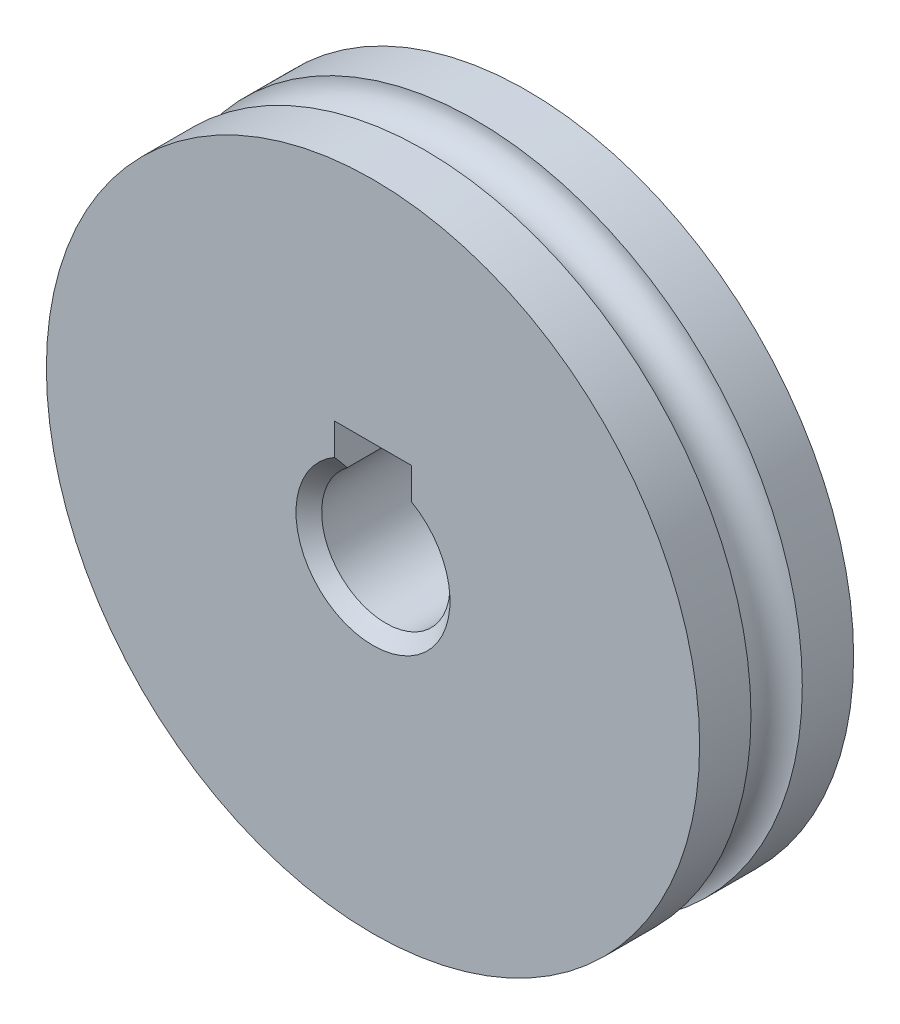
ISO-10303-21;
HEADER;
FILE_DESCRIPTION(('STEP AP214'),'2;1');
FILE_NAME('part.step','',(''),(''),'','','');
FILE_SCHEMA(('AUTOMOTIVE_DESIGN { 1 0 10303 214 1 1 1 1 }'));
ENDSEC;
DATA;
#1=APPLICATION_CONTEXT('core data for automotive mechanical design processes');
#2=APPLICATION_PROTOCOL_DEFINITION('international standard','automotive_design',2000,#1);
#3=PRODUCT_CONTEXT('',#1,'mechanical');
#4=PRODUCT('Part','Part','',(#3));
#5=PRODUCT_RELATED_PRODUCT_CATEGORY('part','',(#4));
#6=PRODUCT_DEFINITION_FORMATION('','',#4);
#7=PRODUCT_DEFINITION_CONTEXT('part definition',#1,'design');
#8=PRODUCT_DEFINITION('design','',#6,#7);
#9=PRODUCT_DEFINITION_SHAPE('','',#8);
#10=(LENGTH_UNIT() NAMED_UNIT(*) SI_UNIT(.MILLI.,.METRE.));
#11=(NAMED_UNIT(*) PLANE_ANGLE_UNIT() SI_UNIT($,.RADIAN.));
#12=(NAMED_UNIT(*) SI_UNIT($,.STERADIAN.) SOLID_ANGLE_UNIT());
#13=UNCERTAINTY_MEASURE_WITH_UNIT(LENGTH_MEASURE(1.E-05),#10,'distance_accuracy_value','');
#14=(GEOMETRIC_REPRESENTATION_CONTEXT(3) GLOBAL_UNCERTAINTY_ASSIGNED_CONTEXT((#13)) GLOBAL_UNIT_ASSIGNED_CONTEXT((#10,
#11,#12)) REPRESENTATION_CONTEXT('',''));
#15=CARTESIAN_POINT('',(0.,0.,0.));
#16=DIRECTION('',(0.,0.,1.));
#17=DIRECTION('',(1.,0.,0.));
#18=AXIS2_PLACEMENT_3D('',#15,#16,#17);
#19=CARTESIAN_POINT('',(0.,0.,12.));
#20=DIRECTION('',(0.,0.,-1.));
#21=DIRECTION('',(-1.,0.,0.));
#22=AXIS2_PLACEMENT_3D('',#19,#20,#21);
#23=CYLINDRICAL_SURFACE('',#22,25.45);
#24=CARTESIAN_POINT('',(0.,0.,8.));
#25=DIRECTION('',(0.,0.,-1.));
#26=DIRECTION('',(-1.,0.,0.));
#27=AXIS2_PLACEMENT_3D('',#24,#25,#26);
#28=CIRCLE('',#27,25.45);
#29=CARTESIAN_POINT('',(-25.45,0.,8.));
#30=VERTEX_POINT('',#29);
#31=EDGE_CURVE('E48',#30,#30,#28,.F.);
#32=ORIENTED_EDGE('',*,*,#31,.T.);
#33=EDGE_LOOP('',(#32));
#34=FACE_BOUND('',#33,.T.);
#35=CARTESIAN_POINT('',(0.,0.,12.));
#36=DIRECTION('',(0.,0.,1.));
#37=DIRECTION('',(1.,0.,0.));
#38=AXIS2_PLACEMENT_3D('',#35,#36,#37);
#39=CIRCLE('',#38,25.45);
#40=CARTESIAN_POINT('',(25.45,0.,12.));
#41=VERTEX_POINT('',#40);
#42=EDGE_CURVE('E177',#41,#41,#39,.T.);
#43=ORIENTED_EDGE('',*,*,#42,.F.);
#44=EDGE_LOOP('',(#43));
#45=FACE_BOUND('',#44,.T.);
#46=ADVANCED_FACE('F42',(#34,#45),#23,.T.);
#47=CARTESIAN_POINT('',(0.,0.,12.));
#48=DIRECTION('',(0.,0.,1.));
#49=DIRECTION('',(1.,0.,0.));
#50=AXIS2_PLACEMENT_3D('',#47,#48,#49);
#51=PLANE('',#50);
#52=DIRECTION('',(0.,1.,0.));
#53=VECTOR('',#52,1.);
#54=CARTESIAN_POINT('',(3.,0.,12.));
#55=LINE('',#54,#53);
#56=CARTESIAN_POINT('',(3.,5.19615242270663,12.));
#57=VERTEX_POINT('',#56);
#58=CARTESIAN_POINT('',(3.,7.65,12.));
#59=VERTEX_POINT('',#58);
#60=EDGE_CURVE('E174',#57,#59,#55,.T.);
#61=ORIENTED_EDGE('',*,*,#60,.F.);
#62=CARTESIAN_POINT('',(0.,0.,12.));
#63=DIRECTION('',(0.,0.,1.));
#64=DIRECTION('',(1.,0.,0.));
#65=AXIS2_PLACEMENT_3D('',#62,#63,#64);
#66=CIRCLE('',#65,6.);
#67=CARTESIAN_POINT('',(-3.,5.19615242270663,12.));
#68=VERTEX_POINT('',#67);
#69=EDGE_CURVE('E156',#57,#68,#66,.F.);
#70=ORIENTED_EDGE('',*,*,#69,.T.);
#71=DIRECTION('',(0.,-1.,0.));
#72=VECTOR('',#71,1.);
#73=CARTESIAN_POINT('',(-3.,0.,12.));
#74=LINE('',#73,#72);
#75=CARTESIAN_POINT('',(-3.,7.65,12.));
#76=VERTEX_POINT('',#75);
#77=EDGE_CURVE('E61',#76,#68,#74,.T.);
#78=ORIENTED_EDGE('',*,*,#77,.F.);
#79=DIRECTION('',(-1.,0.,0.));
#80=VECTOR('',#79,1.);
#81=CARTESIAN_POINT('',(0.,7.65,12.));
#82=LINE('',#81,#80);
#83=EDGE_CURVE('E106',#59,#76,#82,.T.);
#84=ORIENTED_EDGE('',*,*,#83,.F.);
#85=EDGE_LOOP('',(#61,#70,#78,#84));
#86=FACE_BOUND('',#85,.T.);
#87=ORIENTED_EDGE('',*,*,#42,.T.);
#88=EDGE_LOOP('',(#87));
#89=FACE_BOUND('',#88,.T.);
#90=ADVANCED_FACE('F191',(#86,#89),#51,.T.);
#91=CARTESIAN_POINT('',(0.,0.,0.));
#92=DIRECTION('',(0.,0.,1.));
#93=DIRECTION('',(1.,0.,0.));
#94=AXIS2_PLACEMENT_3D('',#91,#92,#93);
#95=PLANE('',#94);
#96=CARTESIAN_POINT('',(0.,0.,0.));
#97=DIRECTION('',(0.,0.,1.));
#98=DIRECTION('',(1.,0.,0.));
#99=AXIS2_PLACEMENT_3D('',#96,#97,#98);
#100=CIRCLE('',#99,6.00000000000001);
#101=CARTESIAN_POINT('',(-3.,5.19615242270665,0.));
#102=VERTEX_POINT('',#101);
#103=CARTESIAN_POINT('',(3.,5.19615242270665,0.));
#104=VERTEX_POINT('',#103);
#105=EDGE_CURVE('E171',#102,#104,#100,.T.);
#106=ORIENTED_EDGE('',*,*,#105,.T.);
#107=DIRECTION('',(0.,-1.,0.));
#108=VECTOR('',#107,1.);
#109=CARTESIAN_POINT('',(3.,0.,0.));
#110=LINE('',#109,#108);
#111=CARTESIAN_POINT('',(3.,7.65,0.));
#112=VERTEX_POINT('',#111);
#113=EDGE_CURVE('E117',#112,#104,#110,.T.);
#114=ORIENTED_EDGE('',*,*,#113,.F.);
#115=DIRECTION('',(1.,0.,0.));
#116=VECTOR('',#115,1.);
#117=CARTESIAN_POINT('',(0.,7.65,0.));
#118=LINE('',#117,#116);
#119=CARTESIAN_POINT('',(-3.,7.65,0.));
#120=VERTEX_POINT('',#119);
#121=EDGE_CURVE('E103',#120,#112,#118,.T.);
#122=ORIENTED_EDGE('',*,*,#121,.F.);
#123=DIRECTION('',(0.,1.,0.));
#124=VECTOR('',#123,1.);
#125=CARTESIAN_POINT('',(-3.,0.,0.));
#126=LINE('',#125,#124);
#127=EDGE_CURVE('E110',#102,#120,#126,.T.);
#128=ORIENTED_EDGE('',*,*,#127,.F.);
#129=EDGE_LOOP('',(#106,#114,#122,#128));
#130=FACE_BOUND('',#129,.T.);
#131=CARTESIAN_POINT('',(0.,0.,0.));
#132=DIRECTION('',(0.,0.,1.));
#133=DIRECTION('',(1.,0.,0.));
#134=AXIS2_PLACEMENT_3D('',#131,#132,#133);
#135=CIRCLE('',#134,25.45);
#136=CARTESIAN_POINT('',(25.45,0.,0.));
#137=VERTEX_POINT('',#136);
#138=EDGE_CURVE('E182',#137,#137,#135,.T.);
#139=ORIENTED_EDGE('',*,*,#138,.F.);
#140=EDGE_LOOP('',(#139));
#141=FACE_BOUND('',#140,.T.);
#142=ADVANCED_FACE('F119',(#130,#141),#95,.F.);
#143=CARTESIAN_POINT('',(0.,0.,4.));
#144=DIRECTION('',(0.,0.,1.));
#145=DIRECTION('',(1.,0.,0.));
#146=AXIS2_PLACEMENT_3D('',#143,#144,#145);
#147=CIRCLE('',#146,25.45);
#148=CARTESIAN_POINT('',(25.45,0.,4.));
#149=VERTEX_POINT('',#148);
#150=EDGE_CURVE('E162',#149,#149,#147,.F.);
#151=ORIENTED_EDGE('',*,*,#150,.T.);
#152=EDGE_LOOP('',(#151));
#153=FACE_BOUND('',#152,.T.);
#154=ORIENTED_EDGE('',*,*,#138,.T.);
#155=EDGE_LOOP('',(#154));
#156=FACE_BOUND('',#155,.T.);
#157=ADVANCED_FACE('F205',(#153,#156),#23,.T.);
#158=CARTESIAN_POINT('',(0.,0.,12.));
#159=DIRECTION('',(0.,0.,-1.));
#160=DIRECTION('',(-1.,0.,0.));
#161=AXIS2_PLACEMENT_3D('',#158,#159,#160);
#162=CYLINDRICAL_SURFACE('',#161,5.);
#163=DIRECTION('',(0.,0.,-1.));
#164=VECTOR('',#163,1.);
#165=CARTESIAN_POINT('',(3.,4.,12.));
#166=LINE('',#165,#164);
#167=CARTESIAN_POINT('',(3.,4.,1.00000000000001));
#168=VERTEX_POINT('',#167);
#169=CARTESIAN_POINT('',(3.,4.,11.));
#170=VERTEX_POINT('',#169);
#171=EDGE_CURVE('E134',#168,#170,#166,.F.);
#172=ORIENTED_EDGE('',*,*,#171,.F.);
#173=CARTESIAN_POINT('',(0.,0.,1.00000000000001));
#174=DIRECTION('',(0.,0.,1.));
#175=DIRECTION('',(1.,0.,0.));
#176=AXIS2_PLACEMENT_3D('',#173,#174,#175);
#177=CIRCLE('',#176,5.);
#178=CARTESIAN_POINT('',(-3.,4.,1.00000000000001));
#179=VERTEX_POINT('',#178);
#180=EDGE_CURVE('E173',#168,#179,#177,.F.);
#181=ORIENTED_EDGE('',*,*,#180,.T.);
#182=DIRECTION('',(0.,0.,-1.));
#183=VECTOR('',#182,1.);
#184=CARTESIAN_POINT('',(-3.,4.,12.));
#185=LINE('',#184,#183);
#186=CARTESIAN_POINT('',(-3.,4.,11.));
#187=VERTEX_POINT('',#186);
#188=EDGE_CURVE('E124',#187,#179,#185,.T.);
#189=ORIENTED_EDGE('',*,*,#188,.F.);
#190=CARTESIAN_POINT('',(0.,0.,11.));
#191=DIRECTION('',(0.,0.,1.));
#192=DIRECTION('',(1.,0.,0.));
#193=AXIS2_PLACEMENT_3D('',#190,#191,#192);
#194=CIRCLE('',#193,5.);
#195=EDGE_CURVE('E176',#187,#170,#194,.T.);
#196=ORIENTED_EDGE('',*,*,#195,.T.);
#197=EDGE_LOOP('',(#172,#181,#189,#196));
#198=FACE_BOUND('',#197,.T.);
#199=ADVANCED_FACE('F196',(#198),#162,.F.);
#200=CARTESIAN_POINT('',(0.,0.,0.));
#201=DIRECTION('',(0.,0.,-1.));
#202=DIRECTION('',(-1.,0.,0.));
#203=AXIS2_PLACEMENT_3D('',#200,#201,#202);
#204=CONICAL_SURFACE('',#203,6.00000000000001,0.785398163397447);
#205=CARTESIAN_POINT('',(3.,5.1969606973692,-0.0007));
#206=CARTESIAN_POINT('',(3.,5.10472855728946,0.0791743967310408));
#207=CARTESIAN_POINT('',(3.,5.01223735922472,0.158750325889475));
#208=CARTESIAN_POINT('',(3.,4.82665017824288,0.317200560471634));
#209=CARTESIAN_POINT('',(3.,4.73355417291088,0.3960748396317));
#210=CARTESIAN_POINT('',(3.,4.45305755189079,0.631631858152734));
#211=CARTESIAN_POINT('',(3.,4.264627386786,0.787093011964924));
#212=CARTESIAN_POINT('',(3.,3.87725980082647,1.09904002196056));
#213=CARTESIAN_POINT('',(3.,3.67818841873575,1.25536097624108));
#214=CARTESIAN_POINT('',(3.,3.3755560048686,1.48446230990329));
#215=CARTESIAN_POINT('',(3.,3.27402428222474,1.55992104438699));
#216=CARTESIAN_POINT('',(3.,3.06935093465372,1.70861807310558));
#217=CARTESIAN_POINT('',(3.,2.96620938959977,1.78185647697759));
#218=CARTESIAN_POINT('',(3.,2.74039239279639,1.93773663880136));
#219=CARTESIAN_POINT('',(3.,2.61736531153247,2.01987202257193));
#220=CARTESIAN_POINT('',(3.,2.36809320190826,2.1791795360388));
#221=CARTESIAN_POINT('',(3.,2.24184780361623,2.25635109153967));
#222=CARTESIAN_POINT('',(3.,1.98733264518479,2.40294286979608));
#223=CARTESIAN_POINT('',(3.,1.85911877135513,2.47245925182793));
#224=CARTESIAN_POINT('',(3.,1.59823390440243,2.60270952327153));
#225=CARTESIAN_POINT('',(3.,1.46556331585218,2.66344420722977));
#226=CARTESIAN_POINT('',(3.,1.22584450071836,2.76062307217585));
#227=CARTESIAN_POINT('',(3.,1.11977163076139,2.79945576339648));
#228=CARTESIAN_POINT('',(3.,0.904816144497557,2.86817062270726));
#229=CARTESIAN_POINT('',(3.,0.795936671364314,2.89806236807184));
#230=CARTESIAN_POINT('',(3.,0.629679946707935,2.93512008727962));
#231=CARTESIAN_POINT('',(3.,0.573171507830584,2.94624908320643));
#232=CARTESIAN_POINT('',(3.,0.459643907305309,2.9655075181252));
#233=CARTESIAN_POINT('',(3.,0.402624786401149,2.9736371942665));
#234=CARTESIAN_POINT('',(3.,0.287995465048128,2.98674722905691));
#235=CARTESIAN_POINT('',(3.,0.230383819288343,2.9917150167704));
#236=CARTESIAN_POINT('',(3.,0.114949768787396,2.99835526062211));
#237=CARTESIAN_POINT('',(3.,0.0571272922453328,3.00002646319238));
#238=CARTESIAN_POINT('',(3.,-0.000699999999999984,2.99999991833335));
#239=B_SPLINE_CURVE_WITH_KNOTS('',3,(#205,#206,#207,#208,#209,#210,#211,#212,#213,#214,#215,
#216,#217,#218,#219,#220,#221,#222,#223,#224,#225,#226,#227,#228,#229,#230,#231,#232,#233,#234,
#235,#236,#237,#238),.UNSPECIFIED.,.F.,.F.,(4,2,2,2,2,2,2,2,2,2,2,2,2,2,2,2,4),(0.,
0.366032714595263,0.732079073096792,1.46488368054643,2.22409183833252,2.6035739757146,
2.98303734412799,3.42672332377148,3.87046053524228,4.30776434015212,4.7450285540959,
5.08360199334359,5.42181145323432,5.59452564828179,5.76722618428539,5.94060911786272,
6.11405796978053),.UNSPECIFIED.);
#240=EDGE_CURVE('E69',#104,#168,#239,.T.);
#241=ORIENTED_EDGE('',*,*,#240,.F.);
#242=ORIENTED_EDGE('',*,*,#105,.F.);
#243=CARTESIAN_POINT('',(-3.,-0.0007,2.99999991833335));
#244=CARTESIAN_POINT('',(-3.,0.0454601457457147,3.00001440854145));
#245=CARTESIAN_POINT('',(-3.,0.0916137280076858,2.99895553984156));
#246=CARTESIAN_POINT('',(-3.,0.183816652352496,2.99472596268915));
#247=CARTESIAN_POINT('',(-3.,0.229866010330678,2.9915556015861));
#248=CARTESIAN_POINT('',(-3.,0.367537246473966,2.97894797467041));
#249=CARTESIAN_POINT('',(-3.,0.458890569986337,2.96641389742184));
#250=CARTESIAN_POINT('',(-3.,0.638499928581178,2.93405630969612));
#251=CARTESIAN_POINT('',(-3.,0.726781940843717,2.9143734159568));
#252=CARTESIAN_POINT('',(-3.,0.901679924472278,2.86856232202215));
#253=CARTESIAN_POINT('',(-3.,0.9882950711066,2.84243101539518));
#254=CARTESIAN_POINT('',(-3.,1.26135148662365,2.75040973203725));
#255=CARTESIAN_POINT('',(-3.,1.44429535337197,2.67413451006544));
#256=CARTESIAN_POINT('',(-3.,1.80185585108093,2.5040257618116));
#257=CARTESIAN_POINT('',(-3.,1.97645612608357,2.41015939176205));
#258=CARTESIAN_POINT('',(-3.,2.32244052483915,2.20874950510435));
#259=CARTESIAN_POINT('',(-3.,2.49367904246243,2.10095918034838));
#260=CARTESIAN_POINT('',(-3.,2.83055905078204,1.87735077307887));
#261=CARTESIAN_POINT('',(-3.,2.99620484837314,1.7615390876284));
#262=CARTESIAN_POINT('',(-3.,3.33989239604002,1.51229335425628));
#263=CARTESIAN_POINT('',(-3.,3.51749716241066,1.37826062968936));
#264=CARTESIAN_POINT('',(-3.,3.86903564909665,1.10539201685767));
#265=CARTESIAN_POINT('',(-3.,4.04296826943176,0.966554721365094));
#266=CARTESIAN_POINT('',(-3.,4.38135438943839,0.690853911137411));
#267=CARTESIAN_POINT('',(-3.,4.54591465920178,0.554121006950186));
#268=CARTESIAN_POINT('',(-3.,4.79118020796446,0.347258083091752));
#269=CARTESIAN_POINT('',(-3.,4.87264953373614,0.278030164089072));
#270=CARTESIAN_POINT('',(-3.,5.0351326568913,0.13904499213581));
#271=CARTESIAN_POINT('',(-3.,5.1161464635414,0.0692877500215555));
#272=CARTESIAN_POINT('',(-3.,5.1969606973692,-0.000700000000000611));
#273=B_SPLINE_CURVE_WITH_KNOTS('',3,(#243,#244,#245,#246,#247,#248,#249,#250,#251,#252,#253,
#254,#255,#256,#257,#258,#259,#260,#261,#262,#263,#264,#265,#266,#267,#268,#269,#270,#271,#272),
.UNSPECIFIED.,.F.,.F.,(4,2,2,2,2,2,2,2,2,2,2,2,2,2,4),(0.,0.138455031958443,0.276887293099806,
0.553129327254988,0.824208437821406,1.09541839271949,1.68843391610198,2.28256787075302,
2.88923870017065,3.49543115784571,4.16282666161247,4.83041932377153,5.47224776003407,
5.79297614342456,6.11369797846812),.UNSPECIFIED.);
#274=EDGE_CURVE('E113',#179,#102,#273,.T.);
#275=ORIENTED_EDGE('',*,*,#274,.F.);
#276=ORIENTED_EDGE('',*,*,#180,.F.);
#277=EDGE_LOOP('',(#241,#242,#275,#276));
#278=FACE_BOUND('',#277,.T.);
#279=ADVANCED_FACE('F137',(#278),#204,.F.);
#280=CARTESIAN_POINT('',(0.,0.,11.));
#281=DIRECTION('',(0.,0.,1.));
#282=DIRECTION('',(1.,0.,0.));
#283=AXIS2_PLACEMENT_3D('',#280,#281,#282);
#284=CONICAL_SURFACE('',#283,5.,0.785398163397447);
#285=CARTESIAN_POINT('',(3.,-0.0007,9.00000008166666));
#286=CARTESIAN_POINT('',(3.,0.0454601457457146,8.99998559145857));
#287=CARTESIAN_POINT('',(3.,0.0916137280076858,9.00104446015846));
#288=CARTESIAN_POINT('',(3.,0.183816652352496,9.00527403731087));
#289=CARTESIAN_POINT('',(3.,0.229866010330678,9.00844439841391));
#290=CARTESIAN_POINT('',(3.,0.367537246473966,9.0210520253296));
#291=CARTESIAN_POINT('',(3.,0.458890569986337,9.03358610257817));
#292=CARTESIAN_POINT('',(3.,0.638499928581178,9.0659436903039));
#293=CARTESIAN_POINT('',(3.,0.726781940843718,9.08562658404321));
#294=CARTESIAN_POINT('',(3.,0.901679924472279,9.13143767797786));
#295=CARTESIAN_POINT('',(3.,0.9882950711066,9.15756898460483));
#296=CARTESIAN_POINT('',(3.,1.26135148662365,9.24959026796277));
#297=CARTESIAN_POINT('',(3.,1.44429535337197,9.32586548993457));
#298=CARTESIAN_POINT('',(3.,1.80185585108092,9.49597423818841));
#299=CARTESIAN_POINT('',(3.,1.97645612608357,9.58984060823796));
#300=CARTESIAN_POINT('',(3.,2.32244052483915,9.79125049489566));
#301=CARTESIAN_POINT('',(3.,2.49367904246243,9.89904081965163));
#302=CARTESIAN_POINT('',(3.,2.83055905078204,10.1226492269211));
#303=CARTESIAN_POINT('',(3.,2.99620484837314,10.2384609123716));
#304=CARTESIAN_POINT('',(3.,3.33989239604001,10.4877066457437));
#305=CARTESIAN_POINT('',(3.,3.51749716241066,10.6217393703106));
#306=CARTESIAN_POINT('',(3.,3.86903564909664,10.8946079831423));
#307=CARTESIAN_POINT('',(3.,4.04296826943175,11.0334452786349));
#308=CARTESIAN_POINT('',(3.,4.38135438943838,11.3091460888626));
#309=CARTESIAN_POINT('',(3.,4.54591465920177,11.4458789930498));
#310=CARTESIAN_POINT('',(3.,4.79118020796444,11.6527419169082));
#311=CARTESIAN_POINT('',(3.,4.87264953373612,11.7219698359109));
#312=CARTESIAN_POINT('',(3.,5.03513265689129,11.8609550078642));
#313=CARTESIAN_POINT('',(3.,5.11614646354139,11.9307122499784));
#314=CARTESIAN_POINT('',(3.,5.19696069736918,12.0007));
#315=B_SPLINE_CURVE_WITH_KNOTS('',3,(#285,#286,#287,#288,#289,#290,#291,#292,#293,#294,#295,
#296,#297,#298,#299,#300,#301,#302,#303,#304,#305,#306,#307,#308,#309,#310,#311,#312,#313,#314),
.UNSPECIFIED.,.F.,.F.,(4,2,2,2,2,2,2,2,2,2,2,2,2,2,4),(0.,0.138455031958444,0.276887293099806,
0.553129327254988,0.824208437821406,1.09541839271949,1.68843391610197,2.28256787075302,
2.88923870017065,3.4954311578457,4.16282666161246,4.83041932377152,5.47224776003406,
5.79297614342454,6.1136979784681),.UNSPECIFIED.);
#316=EDGE_CURVE('E11',#170,#57,#315,.T.);
#317=ORIENTED_EDGE('',*,*,#316,.F.);
#318=ORIENTED_EDGE('',*,*,#195,.F.);
#319=CARTESIAN_POINT('',(-3.,5.19696069736918,12.0007));
#320=CARTESIAN_POINT('',(-3.,5.10472855728945,11.920825603269));
#321=CARTESIAN_POINT('',(-3.,5.01223735922471,11.8412496741105));
#322=CARTESIAN_POINT('',(-3.,4.82665017824287,11.6827994395284));
#323=CARTESIAN_POINT('',(-3.,4.73355417291086,11.6039251603683));
#324=CARTESIAN_POINT('',(-3.,4.45305755189077,11.3683681418473));
#325=CARTESIAN_POINT('',(-3.,4.26462738678599,11.2129069880351));
#326=CARTESIAN_POINT('',(-3.,3.87725980082646,10.9009599780394));
#327=CARTESIAN_POINT('',(-3.,3.67818841873574,10.7446390237589));
#328=CARTESIAN_POINT('',(-3.,3.37555600486859,10.5155376900967));
#329=CARTESIAN_POINT('',(-3.,3.27402428222473,10.440078955613));
#330=CARTESIAN_POINT('',(-3.,3.06935093465371,10.2913819268944));
#331=CARTESIAN_POINT('',(-3.,2.96620938959976,10.2181435230224));
#332=CARTESIAN_POINT('',(-3.,2.74039239279637,10.0622633611987));
#333=CARTESIAN_POINT('',(-3.,2.61736531153246,9.98012797742808));
#334=CARTESIAN_POINT('',(-3.,2.36809320190825,9.8208204639612));
#335=CARTESIAN_POINT('',(-3.,2.24184780361622,9.74364890846033));
#336=CARTESIAN_POINT('',(-3.,1.98733264518478,9.59705713020393));
#337=CARTESIAN_POINT('',(-3.,1.85911877135512,9.52754074817208));
#338=CARTESIAN_POINT('',(-3.,1.59823390440242,9.39729047672848));
#339=CARTESIAN_POINT('',(-3.,1.46556331585217,9.33655579277024));
#340=CARTESIAN_POINT('',(-3.,1.22584450071835,9.23937692782417));
#341=CARTESIAN_POINT('',(-3.,1.11977163076138,9.20054423660353));
#342=CARTESIAN_POINT('',(-3.,0.904816144497551,9.13182937729275));
#343=CARTESIAN_POINT('',(-3.,0.795936671364309,9.10193763192818));
#344=CARTESIAN_POINT('',(-3.,0.62967994670793,9.0648799127204));
#345=CARTESIAN_POINT('',(-3.,0.57317150783058,9.05375091679358));
#346=CARTESIAN_POINT('',(-3.,0.459643907305305,9.03449248187481));
#347=CARTESIAN_POINT('',(-3.,0.402624786401145,9.02636280573352));
#348=CARTESIAN_POINT('',(-3.,0.287995465048125,9.01325277094311));
#349=CARTESIAN_POINT('',(-3.,0.230383819288341,9.00828498322962));
#350=CARTESIAN_POINT('',(-3.,0.114949768787395,9.0016447393779));
#351=CARTESIAN_POINT('',(-3.,0.0571272922453327,8.99997353680763));
#352=CARTESIAN_POINT('',(-3.,-0.000699999999999918,9.00000008166666));
#353=B_SPLINE_CURVE_WITH_KNOTS('',3,(#319,#320,#321,#322,#323,#324,#325,#326,#327,#328,#329,
#330,#331,#332,#333,#334,#335,#336,#337,#338,#339,#340,#341,#342,#343,#344,#345,#346,#347,#348,
#349,#350,#351,#352),.UNSPECIFIED.,.F.,.F.,(4,2,2,2,2,2,2,2,2,2,2,2,2,2,2,2,4),(0.,
0.366032714595263,0.732079073096791,1.46488368054643,2.22409183833251,2.6035739757146,
2.98303734412798,3.42672332377147,3.87046053524227,4.30776434015211,4.74502855409589,
5.08360199334358,5.4218114532343,5.59452564828177,5.76722618428537,5.9406091178627,
6.1140579697805),.UNSPECIFIED.);
#354=EDGE_CURVE('E53',#68,#187,#353,.T.);
#355=ORIENTED_EDGE('',*,*,#354,.F.);
#356=ORIENTED_EDGE('',*,*,#69,.F.);
#357=EDGE_LOOP('',(#317,#318,#355,#356));
#358=FACE_BOUND('',#357,.T.);
#359=ADVANCED_FACE('F45',(#358),#284,.F.);
#360=CARTESIAN_POINT('',(3.,0.,19.));
#361=DIRECTION('',(1.,0.,0.));
#362=DIRECTION('',(0.,0.,-1.));
#363=AXIS2_PLACEMENT_3D('',#360,#361,#362);
#364=PLANE('',#363);
#365=ORIENTED_EDGE('',*,*,#240,.T.);
#366=ORIENTED_EDGE('',*,*,#171,.T.);
#367=ORIENTED_EDGE('',*,*,#316,.T.);
#368=ORIENTED_EDGE('',*,*,#60,.T.);
#369=DIRECTION('',(0.,0.,-1.));
#370=VECTOR('',#369,1.);
#371=CARTESIAN_POINT('',(3.,7.65,19.));
#372=LINE('',#371,#370);
#373=EDGE_CURVE('E107',#59,#112,#372,.T.);
#374=ORIENTED_EDGE('',*,*,#373,.T.);
#375=ORIENTED_EDGE('',*,*,#113,.T.);
#376=EDGE_LOOP('',(#365,#366,#367,#368,#374,#375));
#377=FACE_BOUND('',#376,.T.);
#378=ADVANCED_FACE('F146',(#377),#364,.F.);
#379=CARTESIAN_POINT('',(0.,7.65,19.));
#380=DIRECTION('',(0.,1.,0.));
#381=DIRECTION('',(0.,0.,1.));
#382=AXIS2_PLACEMENT_3D('',#379,#380,#381);
#383=PLANE('',#382);
#384=ORIENTED_EDGE('',*,*,#83,.T.);
#385=DIRECTION('',(0.,0.,-1.));
#386=VECTOR('',#385,1.);
#387=CARTESIAN_POINT('',(-3.,7.65,19.));
#388=LINE('',#387,#386);
#389=EDGE_CURVE('E98',#76,#120,#388,.T.);
#390=ORIENTED_EDGE('',*,*,#389,.T.);
#391=ORIENTED_EDGE('',*,*,#121,.T.);
#392=ORIENTED_EDGE('',*,*,#373,.F.);
#393=EDGE_LOOP('',(#384,#390,#391,#392));
#394=FACE_BOUND('',#393,.T.);
#395=ADVANCED_FACE('F100',(#394),#383,.F.);
#396=CARTESIAN_POINT('',(-3.,0.,19.));
#397=DIRECTION('',(-1.,0.,0.));
#398=DIRECTION('',(0.,0.,1.));
#399=AXIS2_PLACEMENT_3D('',#396,#397,#398);
#400=PLANE('',#399);
#401=ORIENTED_EDGE('',*,*,#274,.T.);
#402=ORIENTED_EDGE('',*,*,#127,.T.);
#403=ORIENTED_EDGE('',*,*,#389,.F.);
#404=ORIENTED_EDGE('',*,*,#77,.T.);
#405=ORIENTED_EDGE('',*,*,#354,.T.);
#406=ORIENTED_EDGE('',*,*,#188,.T.);
#407=EDGE_LOOP('',(#401,#402,#403,#404,#405,#406));
#408=FACE_BOUND('',#407,.T.);
#409=ADVANCED_FACE('F111',(#408),#400,.F.);
#410=CARTESIAN_POINT('',(0.,0.,6.));
#411=DIRECTION('',(0.,0.,1.));
#412=DIRECTION('',(1.,0.,0.));
#413=AXIS2_PLACEMENT_3D('',#410,#411,#412);
#414=TOROIDAL_SURFACE('',#413,25.45,2.);
#415=ORIENTED_EDGE('',*,*,#150,.F.);
#416=EDGE_LOOP('',(#415));
#417=FACE_BOUND('',#416,.T.);
#418=ORIENTED_EDGE('',*,*,#31,.F.);
#419=EDGE_LOOP('',(#418));
#420=FACE_BOUND('',#419,.T.);
#421=ADVANCED_FACE('F144',(#417,#420),#414,.F.);
#422=CLOSED_SHELL('',(#46,#90,#142,#157,#199,#279,#359,#378,#395,#409,#421));
#423=MANIFOLD_SOLID_BREP('B2',#422);
#424=ADVANCED_BREP_SHAPE_REPRESENTATION('',(#18,#423),#14);
#425=SHAPE_DEFINITION_REPRESENTATION(#9,#424);
ENDSEC;
END-ISO-10303-21;
